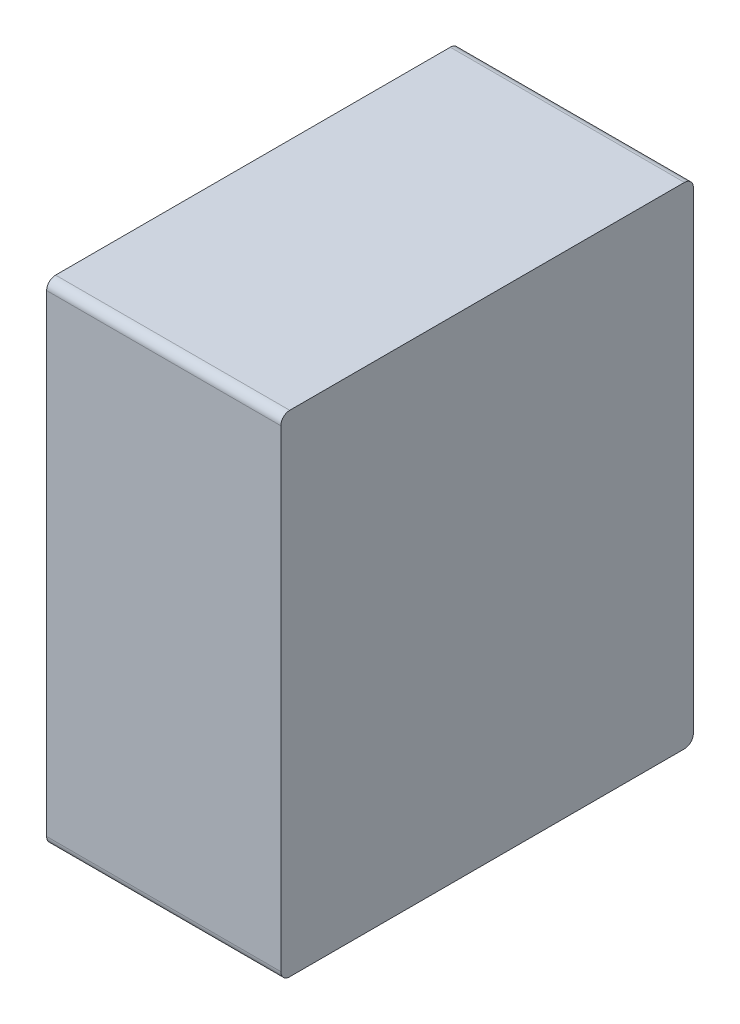
ISO-10303-21;
HEADER;
FILE_DESCRIPTION(('STEP AP214'),'2;1');
FILE_NAME('part.step','',(''),(''),'','','');
FILE_SCHEMA(('AUTOMOTIVE_DESIGN { 1 0 10303 214 1 1 1 1 }'));
ENDSEC;
DATA;
#1=APPLICATION_CONTEXT('core data for automotive mechanical design processes');
#2=APPLICATION_PROTOCOL_DEFINITION('international standard','automotive_design',2000,#1);
#3=PRODUCT_CONTEXT('',#1,'mechanical');
#4=PRODUCT('Part','Part','',(#3));
#5=PRODUCT_RELATED_PRODUCT_CATEGORY('part','',(#4));
#6=PRODUCT_DEFINITION_FORMATION('','',#4);
#7=PRODUCT_DEFINITION_CONTEXT('part definition',#1,'design');
#8=PRODUCT_DEFINITION('design','',#6,#7);
#9=PRODUCT_DEFINITION_SHAPE('','',#8);
#10=(LENGTH_UNIT() NAMED_UNIT(*) SI_UNIT(.MILLI.,.METRE.));
#11=(NAMED_UNIT(*) PLANE_ANGLE_UNIT() SI_UNIT($,.RADIAN.));
#12=(NAMED_UNIT(*) SI_UNIT($,.STERADIAN.) SOLID_ANGLE_UNIT());
#13=UNCERTAINTY_MEASURE_WITH_UNIT(LENGTH_MEASURE(1.E-05),#10,'distance_accuracy_value','');
#14=(GEOMETRIC_REPRESENTATION_CONTEXT(3) GLOBAL_UNCERTAINTY_ASSIGNED_CONTEXT((#13)) GLOBAL_UNIT_ASSIGNED_CONTEXT((#10,
#11,#12)) REPRESENTATION_CONTEXT('',''));
#15=CARTESIAN_POINT('',(0.,0.,0.));
#16=DIRECTION('',(0.,0.,1.));
#17=DIRECTION('',(1.,0.,0.));
#18=AXIS2_PLACEMENT_3D('',#15,#16,#17);
#19=CARTESIAN_POINT('',(105.,0.,0.));
#20=DIRECTION('',(0.,0.,-1.));
#21=DIRECTION('',(0.,1.,0.));
#22=AXIS2_PLACEMENT_3D('',#19,#20,#21);
#23=PLANE('',#22);
#24=DIRECTION('',(0.,-1.,0.));
#25=VECTOR('',#24,1.);
#26=CARTESIAN_POINT('',(0.,0.,0.));
#27=LINE('',#26,#25);
#28=CARTESIAN_POINT('',(0.,-4.,0.));
#29=VERTEX_POINT('',#28);
#30=CARTESIAN_POINT('',(0.,-216.,0.));
#31=VERTEX_POINT('',#30);
#32=EDGE_CURVE('E157',#29,#31,#27,.T.);
#33=ORIENTED_EDGE('',*,*,#32,.T.);
#34=DIRECTION('',(-1.,0.,0.));
#35=VECTOR('',#34,1.);
#36=CARTESIAN_POINT('',(105.,-216.,0.));
#37=LINE('',#36,#35);
#38=CARTESIAN_POINT('',(105.,-216.,0.));
#39=VERTEX_POINT('',#38);
#40=EDGE_CURVE('E11',#31,#39,#37,.F.);
#41=ORIENTED_EDGE('',*,*,#40,.T.);
#42=DIRECTION('',(0.,-1.,0.));
#43=VECTOR('',#42,1.);
#44=CARTESIAN_POINT('',(105.,0.,0.));
#45=LINE('',#44,#43);
#46=CARTESIAN_POINT('',(105.,-4.,0.));
#47=VERTEX_POINT('',#46);
#48=EDGE_CURVE('E125',#47,#39,#45,.T.);
#49=ORIENTED_EDGE('',*,*,#48,.F.);
#50=DIRECTION('',(-1.,0.,0.));
#51=VECTOR('',#50,1.);
#52=CARTESIAN_POINT('',(105.,-4.,0.));
#53=LINE('',#52,#51);
#54=EDGE_CURVE('E41',#47,#29,#53,.T.);
#55=ORIENTED_EDGE('',*,*,#54,.T.);
#56=EDGE_LOOP('',(#33,#41,#49,#55));
#57=FACE_BOUND('',#56,.T.);
#58=ADVANCED_FACE('F33',(#57),#23,.F.);
#59=CARTESIAN_POINT('',(105.,-220.,0.));
#60=DIRECTION('',(0.,1.,0.));
#61=DIRECTION('',(0.,0.,1.));
#62=AXIS2_PLACEMENT_3D('',#59,#60,#61);
#63=PLANE('',#62);
#64=DIRECTION('',(0.,0.,-1.));
#65=VECTOR('',#64,1.);
#66=CARTESIAN_POINT('',(0.,-220.,0.));
#67=LINE('',#66,#65);
#68=CARTESIAN_POINT('',(0.,-220.,-4.00000000000003));
#69=VERTEX_POINT('',#68);
#70=CARTESIAN_POINT('',(0.,-220.,-181.));
#71=VERTEX_POINT('',#70);
#72=EDGE_CURVE('E130',#69,#71,#67,.T.);
#73=ORIENTED_EDGE('',*,*,#72,.T.);
#74=DIRECTION('',(-1.,0.,0.));
#75=VECTOR('',#74,1.);
#76=CARTESIAN_POINT('',(105.,-220.,-181.));
#77=LINE('',#76,#75);
#78=CARTESIAN_POINT('',(105.,-220.,-181.));
#79=VERTEX_POINT('',#78);
#80=EDGE_CURVE('E48',#71,#79,#77,.F.);
#81=ORIENTED_EDGE('',*,*,#80,.T.);
#82=DIRECTION('',(0.,0.,-1.));
#83=VECTOR('',#82,1.);
#84=CARTESIAN_POINT('',(105.,-220.,0.));
#85=LINE('',#84,#83);
#86=CARTESIAN_POINT('',(105.,-220.,-4.00000000000003));
#87=VERTEX_POINT('',#86);
#88=EDGE_CURVE('E128',#87,#79,#85,.T.);
#89=ORIENTED_EDGE('',*,*,#88,.F.);
#90=DIRECTION('',(-1.,0.,0.));
#91=VECTOR('',#90,1.);
#92=CARTESIAN_POINT('',(105.,-220.,-4.00000000000003));
#93=LINE('',#92,#91);
#94=EDGE_CURVE('E149',#87,#69,#93,.T.);
#95=ORIENTED_EDGE('',*,*,#94,.T.);
#96=EDGE_LOOP('',(#73,#81,#89,#95));
#97=FACE_BOUND('',#96,.T.);
#98=ADVANCED_FACE('F177',(#97),#63,.F.);
#99=CARTESIAN_POINT('',(105.,0.,-185.));
#100=DIRECTION('',(0.,0.,1.));
#101=DIRECTION('',(0.,-1.,0.));
#102=AXIS2_PLACEMENT_3D('',#99,#100,#101);
#103=PLANE('',#102);
#104=DIRECTION('',(0.,1.,0.));
#105=VECTOR('',#104,1.);
#106=CARTESIAN_POINT('',(0.,0.,-185.));
#107=LINE('',#106,#105);
#108=CARTESIAN_POINT('',(0.,-216.,-185.));
#109=VERTEX_POINT('',#108);
#110=CARTESIAN_POINT('',(0.,-4.,-185.));
#111=VERTEX_POINT('',#110);
#112=EDGE_CURVE('E126',#109,#111,#107,.T.);
#113=ORIENTED_EDGE('',*,*,#112,.T.);
#114=DIRECTION('',(-1.,0.,0.));
#115=VECTOR('',#114,1.);
#116=CARTESIAN_POINT('',(105.,-4.,-185.));
#117=LINE('',#116,#115);
#118=CARTESIAN_POINT('',(105.,-4.,-185.));
#119=VERTEX_POINT('',#118);
#120=EDGE_CURVE('E104',#111,#119,#117,.F.);
#121=ORIENTED_EDGE('',*,*,#120,.T.);
#122=DIRECTION('',(0.,1.,0.));
#123=VECTOR('',#122,1.);
#124=CARTESIAN_POINT('',(105.,0.,-185.));
#125=LINE('',#124,#123);
#126=CARTESIAN_POINT('',(105.,-216.,-185.));
#127=VERTEX_POINT('',#126);
#128=EDGE_CURVE('E165',#127,#119,#125,.T.);
#129=ORIENTED_EDGE('',*,*,#128,.F.);
#130=DIRECTION('',(-1.,0.,0.));
#131=VECTOR('',#130,1.);
#132=CARTESIAN_POINT('',(105.,-216.,-185.));
#133=LINE('',#132,#131);
#134=EDGE_CURVE('E109',#127,#109,#133,.T.);
#135=ORIENTED_EDGE('',*,*,#134,.T.);
#136=EDGE_LOOP('',(#113,#121,#129,#135));
#137=FACE_BOUND('',#136,.T.);
#138=ADVANCED_FACE('F176',(#137),#103,.F.);
#139=CARTESIAN_POINT('',(105.,0.,0.));
#140=DIRECTION('',(0.,-1.,0.));
#141=DIRECTION('',(0.,0.,-1.));
#142=AXIS2_PLACEMENT_3D('',#139,#140,#141);
#143=PLANE('',#142);
#144=DIRECTION('',(0.,0.,1.));
#145=VECTOR('',#144,1.);
#146=CARTESIAN_POINT('',(105.,0.,0.));
#147=LINE('',#146,#145);
#148=CARTESIAN_POINT('',(105.,0.,-181.));
#149=VERTEX_POINT('',#148);
#150=CARTESIAN_POINT('',(105.,0.,-4.));
#151=VERTEX_POINT('',#150);
#152=EDGE_CURVE('E119',#149,#151,#147,.T.);
#153=ORIENTED_EDGE('',*,*,#152,.F.);
#154=DIRECTION('',(-1.,0.,0.));
#155=VECTOR('',#154,1.);
#156=CARTESIAN_POINT('',(105.,0.,-181.));
#157=LINE('',#156,#155);
#158=CARTESIAN_POINT('',(0.,0.,-181.));
#159=VERTEX_POINT('',#158);
#160=EDGE_CURVE('E103',#149,#159,#157,.T.);
#161=ORIENTED_EDGE('',*,*,#160,.T.);
#162=DIRECTION('',(0.,0.,1.));
#163=VECTOR('',#162,1.);
#164=CARTESIAN_POINT('',(0.,0.,0.));
#165=LINE('',#164,#163);
#166=CARTESIAN_POINT('',(0.,0.,-4.));
#167=VERTEX_POINT('',#166);
#168=EDGE_CURVE('E116',#159,#167,#165,.T.);
#169=ORIENTED_EDGE('',*,*,#168,.T.);
#170=DIRECTION('',(-1.,0.,0.));
#171=VECTOR('',#170,1.);
#172=CARTESIAN_POINT('',(105.,0.,-4.));
#173=LINE('',#172,#171);
#174=EDGE_CURVE('E121',#167,#151,#173,.F.);
#175=ORIENTED_EDGE('',*,*,#174,.T.);
#176=EDGE_LOOP('',(#153,#161,#169,#175));
#177=FACE_BOUND('',#176,.T.);
#178=ADVANCED_FACE('F115',(#177),#143,.F.);
#179=CARTESIAN_POINT('',(105.,0.,0.));
#180=DIRECTION('',(1.,0.,0.));
#181=DIRECTION('',(0.,0.,-1.));
#182=AXIS2_PLACEMENT_3D('',#179,#180,#181);
#183=PLANE('',#182);
#184=ORIENTED_EDGE('',*,*,#128,.T.);
#185=CARTESIAN_POINT('',(105.,-4.,-181.));
#186=DIRECTION('',(1.,0.,0.));
#187=DIRECTION('',(0.,0.,-1.));
#188=AXIS2_PLACEMENT_3D('',#185,#186,#187);
#189=CIRCLE('',#188,4.);
#190=EDGE_CURVE('E147',#119,#149,#189,.T.);
#191=ORIENTED_EDGE('',*,*,#190,.T.);
#192=ORIENTED_EDGE('',*,*,#152,.T.);
#193=CARTESIAN_POINT('',(105.,-4.,-4.));
#194=DIRECTION('',(1.,0.,0.));
#195=DIRECTION('',(0.,0.,-1.));
#196=AXIS2_PLACEMENT_3D('',#193,#194,#195);
#197=CIRCLE('',#196,4.);
#198=EDGE_CURVE('E142',#151,#47,#197,.T.);
#199=ORIENTED_EDGE('',*,*,#198,.T.);
#200=ORIENTED_EDGE('',*,*,#48,.T.);
#201=CARTESIAN_POINT('',(105.,-216.,-4.00000000000003));
#202=DIRECTION('',(1.,0.,0.));
#203=DIRECTION('',(0.,0.,-1.));
#204=AXIS2_PLACEMENT_3D('',#201,#202,#203);
#205=CIRCLE('',#204,4.);
#206=EDGE_CURVE('E55',#39,#87,#205,.T.);
#207=ORIENTED_EDGE('',*,*,#206,.T.);
#208=ORIENTED_EDGE('',*,*,#88,.T.);
#209=CARTESIAN_POINT('',(105.,-216.,-181.));
#210=DIRECTION('',(1.,0.,0.));
#211=DIRECTION('',(0.,0.,-1.));
#212=AXIS2_PLACEMENT_3D('',#209,#210,#211);
#213=CIRCLE('',#212,4.);
#214=EDGE_CURVE('E145',#79,#127,#213,.T.);
#215=ORIENTED_EDGE('',*,*,#214,.T.);
#216=EDGE_LOOP('',(#184,#191,#192,#199,#200,#207,#208,#215));
#217=FACE_BOUND('',#216,.T.);
#218=ADVANCED_FACE('F169',(#217),#183,.T.);
#219=CARTESIAN_POINT('',(0.,0.,0.));
#220=DIRECTION('',(1.,0.,0.));
#221=DIRECTION('',(0.,0.,-1.));
#222=AXIS2_PLACEMENT_3D('',#219,#220,#221);
#223=PLANE('',#222);
#224=ORIENTED_EDGE('',*,*,#168,.F.);
#225=CARTESIAN_POINT('',(0.,-4.,-181.));
#226=DIRECTION('',(1.,0.,0.));
#227=DIRECTION('',(0.,0.,-1.));
#228=AXIS2_PLACEMENT_3D('',#225,#226,#227);
#229=CIRCLE('',#228,4.);
#230=EDGE_CURVE('E99',#159,#111,#229,.F.);
#231=ORIENTED_EDGE('',*,*,#230,.T.);
#232=ORIENTED_EDGE('',*,*,#112,.F.);
#233=CARTESIAN_POINT('',(0.,-216.,-181.));
#234=DIRECTION('',(1.,0.,0.));
#235=DIRECTION('',(0.,0.,-1.));
#236=AXIS2_PLACEMENT_3D('',#233,#234,#235);
#237=CIRCLE('',#236,4.);
#238=EDGE_CURVE('E110',#109,#71,#237,.F.);
#239=ORIENTED_EDGE('',*,*,#238,.T.);
#240=ORIENTED_EDGE('',*,*,#72,.F.);
#241=CARTESIAN_POINT('',(0.,-216.,-4.00000000000003));
#242=DIRECTION('',(1.,0.,0.));
#243=DIRECTION('',(0.,0.,-1.));
#244=AXIS2_PLACEMENT_3D('',#241,#242,#243);
#245=CIRCLE('',#244,4.);
#246=EDGE_CURVE('E136',#69,#31,#245,.F.);
#247=ORIENTED_EDGE('',*,*,#246,.T.);
#248=ORIENTED_EDGE('',*,*,#32,.F.);
#249=CARTESIAN_POINT('',(0.,-4.,-4.));
#250=DIRECTION('',(1.,0.,0.));
#251=DIRECTION('',(0.,0.,-1.));
#252=AXIS2_PLACEMENT_3D('',#249,#250,#251);
#253=CIRCLE('',#252,4.);
#254=EDGE_CURVE('E120',#29,#167,#253,.F.);
#255=ORIENTED_EDGE('',*,*,#254,.T.);
#256=EDGE_LOOP('',(#224,#231,#232,#239,#240,#247,#248,#255));
#257=FACE_BOUND('',#256,.T.);
#258=ADVANCED_FACE('F123',(#257),#223,.F.);
#259=CARTESIAN_POINT('',(105.,-4.,-181.));
#260=DIRECTION('',(-1.,0.,0.));
#261=DIRECTION('',(0.,0.,1.));
#262=AXIS2_PLACEMENT_3D('',#259,#260,#261);
#263=CYLINDRICAL_SURFACE('',#262,4.);
#264=ORIENTED_EDGE('',*,*,#190,.F.);
#265=ORIENTED_EDGE('',*,*,#120,.F.);
#266=ORIENTED_EDGE('',*,*,#230,.F.);
#267=ORIENTED_EDGE('',*,*,#160,.F.);
#268=EDGE_LOOP('',(#264,#265,#266,#267));
#269=FACE_BOUND('',#268,.T.);
#270=ADVANCED_FACE('F102',(#269),#263,.T.);
#271=CARTESIAN_POINT('',(105.,-216.,-181.));
#272=DIRECTION('',(-1.,0.,0.));
#273=DIRECTION('',(0.,0.,1.));
#274=AXIS2_PLACEMENT_3D('',#271,#272,#273);
#275=CYLINDRICAL_SURFACE('',#274,4.);
#276=ORIENTED_EDGE('',*,*,#214,.F.);
#277=ORIENTED_EDGE('',*,*,#80,.F.);
#278=ORIENTED_EDGE('',*,*,#238,.F.);
#279=ORIENTED_EDGE('',*,*,#134,.F.);
#280=EDGE_LOOP('',(#276,#277,#278,#279));
#281=FACE_BOUND('',#280,.T.);
#282=ADVANCED_FACE('F174',(#281),#275,.T.);
#283=CARTESIAN_POINT('',(105.,-216.,-4.00000000000003));
#284=DIRECTION('',(-1.,0.,0.));
#285=DIRECTION('',(0.,0.,1.));
#286=AXIS2_PLACEMENT_3D('',#283,#284,#285);
#287=CYLINDRICAL_SURFACE('',#286,4.);
#288=ORIENTED_EDGE('',*,*,#206,.F.);
#289=ORIENTED_EDGE('',*,*,#40,.F.);
#290=ORIENTED_EDGE('',*,*,#246,.F.);
#291=ORIENTED_EDGE('',*,*,#94,.F.);
#292=EDGE_LOOP('',(#288,#289,#290,#291));
#293=FACE_BOUND('',#292,.T.);
#294=ADVANCED_FACE('F179',(#293),#287,.T.);
#295=CARTESIAN_POINT('',(105.,-4.,-4.));
#296=DIRECTION('',(-1.,0.,0.));
#297=DIRECTION('',(0.,0.,1.));
#298=AXIS2_PLACEMENT_3D('',#295,#296,#297);
#299=CYLINDRICAL_SURFACE('',#298,4.);
#300=ORIENTED_EDGE('',*,*,#198,.F.);
#301=ORIENTED_EDGE('',*,*,#174,.F.);
#302=ORIENTED_EDGE('',*,*,#254,.F.);
#303=ORIENTED_EDGE('',*,*,#54,.F.);
#304=EDGE_LOOP('',(#300,#301,#302,#303));
#305=FACE_BOUND('',#304,.T.);
#306=ADVANCED_FACE('F35',(#305),#299,.T.);
#307=CLOSED_SHELL('',(#58,#98,#138,#178,#218,#258,#270,#282,#294,#306));
#308=MANIFOLD_SOLID_BREP('B2',#307);
#309=ADVANCED_BREP_SHAPE_REPRESENTATION('',(#18,#308),#14);
#310=SHAPE_DEFINITION_REPRESENTATION(#9,#309);
ENDSEC;
END-ISO-10303-21;
